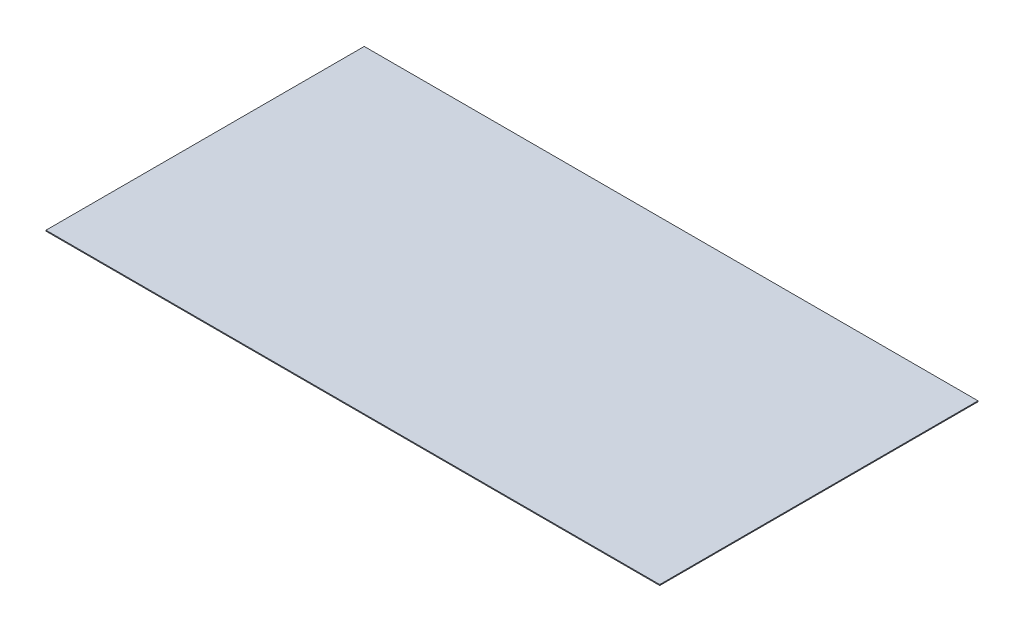
ISO-10303-21;
HEADER;
FILE_DESCRIPTION(('STEP AP214'),'2;1');
FILE_NAME('part.step','',(''),(''),'','','');
FILE_SCHEMA(('AUTOMOTIVE_DESIGN { 1 0 10303 214 1 1 1 1 }'));
ENDSEC;
DATA;
#1=APPLICATION_CONTEXT('core data for automotive mechanical design processes');
#2=APPLICATION_PROTOCOL_DEFINITION('international standard','automotive_design',2000,#1);
#3=PRODUCT_CONTEXT('',#1,'mechanical');
#4=PRODUCT('Part','Part','',(#3));
#5=PRODUCT_RELATED_PRODUCT_CATEGORY('part','',(#4));
#6=PRODUCT_DEFINITION_FORMATION('','',#4);
#7=PRODUCT_DEFINITION_CONTEXT('part definition',#1,'design');
#8=PRODUCT_DEFINITION('design','',#6,#7);
#9=PRODUCT_DEFINITION_SHAPE('','',#8);
#10=(LENGTH_UNIT() NAMED_UNIT(*) SI_UNIT(.MILLI.,.METRE.));
#11=(NAMED_UNIT(*) PLANE_ANGLE_UNIT() SI_UNIT($,.RADIAN.));
#12=(NAMED_UNIT(*) SI_UNIT($,.STERADIAN.) SOLID_ANGLE_UNIT());
#13=UNCERTAINTY_MEASURE_WITH_UNIT(LENGTH_MEASURE(1.E-05),#10,'distance_accuracy_value','');
#14=(GEOMETRIC_REPRESENTATION_CONTEXT(3) GLOBAL_UNCERTAINTY_ASSIGNED_CONTEXT((#13)) GLOBAL_UNIT_ASSIGNED_CONTEXT((#10,
#11,#12)) REPRESENTATION_CONTEXT('',''));
#15=CARTESIAN_POINT('',(0.,0.,0.));
#16=DIRECTION('',(0.,0.,1.));
#17=DIRECTION('',(1.,0.,0.));
#18=AXIS2_PLACEMENT_3D('',#15,#16,#17);
#19=CARTESIAN_POINT('',(0.,2.,0.));
#20=DIRECTION('',(1.,0.,0.));
#21=DIRECTION('',(0.,0.,-1.));
#22=AXIS2_PLACEMENT_3D('',#19,#20,#21);
#23=PLANE('',#22);
#24=DIRECTION('',(0.,0.,1.));
#25=VECTOR('',#24,1.);
#26=CARTESIAN_POINT('',(0.,0.,0.));
#27=LINE('',#26,#25);
#28=CARTESIAN_POINT('',(0.,0.,-700.));
#29=VERTEX_POINT('',#28);
#30=CARTESIAN_POINT('',(0.,0.,0.));
#31=VERTEX_POINT('',#30);
#32=EDGE_CURVE('E106',#29,#31,#27,.T.);
#33=ORIENTED_EDGE('',*,*,#32,.T.);
#34=DIRECTION('',(0.,-1.,0.));
#35=VECTOR('',#34,1.);
#36=CARTESIAN_POINT('',(0.,2.,0.));
#37=LINE('',#36,#35);
#38=CARTESIAN_POINT('',(0.,2.,0.));
#39=VERTEX_POINT('',#38);
#40=EDGE_CURVE('E11',#39,#31,#37,.T.);
#41=ORIENTED_EDGE('',*,*,#40,.F.);
#42=DIRECTION('',(0.,0.,1.));
#43=VECTOR('',#42,1.);
#44=CARTESIAN_POINT('',(0.,2.,0.));
#45=LINE('',#44,#43);
#46=CARTESIAN_POINT('',(0.,2.,-700.));
#47=VERTEX_POINT('',#46);
#48=EDGE_CURVE('E94',#47,#39,#45,.T.);
#49=ORIENTED_EDGE('',*,*,#48,.F.);
#50=DIRECTION('',(0.,-1.,0.));
#51=VECTOR('',#50,1.);
#52=CARTESIAN_POINT('',(0.,2.,-700.));
#53=LINE('',#52,#51);
#54=EDGE_CURVE('E105',#47,#29,#53,.T.);
#55=ORIENTED_EDGE('',*,*,#54,.T.);
#56=EDGE_LOOP('',(#33,#41,#49,#55));
#57=FACE_BOUND('',#56,.T.);
#58=ADVANCED_FACE('F43',(#57),#23,.F.);
#59=CARTESIAN_POINT('',(0.,2.,0.));
#60=DIRECTION('',(0.,0.,-1.));
#61=DIRECTION('',(-1.,0.,0.));
#62=AXIS2_PLACEMENT_3D('',#59,#60,#61);
#63=PLANE('',#62);
#64=DIRECTION('',(1.,0.,0.));
#65=VECTOR('',#64,1.);
#66=CARTESIAN_POINT('',(0.,0.,0.));
#67=LINE('',#66,#65);
#68=CARTESIAN_POINT('',(1350.,0.,0.));
#69=VERTEX_POINT('',#68);
#70=EDGE_CURVE('E98',#31,#69,#67,.T.);
#71=ORIENTED_EDGE('',*,*,#70,.T.);
#72=DIRECTION('',(0.,-1.,0.));
#73=VECTOR('',#72,1.);
#74=CARTESIAN_POINT('',(1350.,2.,0.));
#75=LINE('',#74,#73);
#76=CARTESIAN_POINT('',(1350.,2.,0.));
#77=VERTEX_POINT('',#76);
#78=EDGE_CURVE('E51',#77,#69,#75,.T.);
#79=ORIENTED_EDGE('',*,*,#78,.F.);
#80=DIRECTION('',(1.,0.,0.));
#81=VECTOR('',#80,1.);
#82=CARTESIAN_POINT('',(0.,2.,0.));
#83=LINE('',#82,#81);
#84=EDGE_CURVE('E90',#39,#77,#83,.T.);
#85=ORIENTED_EDGE('',*,*,#84,.F.);
#86=ORIENTED_EDGE('',*,*,#40,.T.);
#87=EDGE_LOOP('',(#71,#79,#85,#86));
#88=FACE_BOUND('',#87,.T.);
#89=ADVANCED_FACE('F100',(#88),#63,.F.);
#90=CARTESIAN_POINT('',(1350.,2.,0.));
#91=DIRECTION('',(-1.,0.,0.));
#92=DIRECTION('',(0.,0.,1.));
#93=AXIS2_PLACEMENT_3D('',#90,#91,#92);
#94=PLANE('',#93);
#95=DIRECTION('',(0.,0.,-1.));
#96=VECTOR('',#95,1.);
#97=CARTESIAN_POINT('',(1350.,0.,0.));
#98=LINE('',#97,#96);
#99=CARTESIAN_POINT('',(1350.,0.,-700.));
#100=VERTEX_POINT('',#99);
#101=EDGE_CURVE('E77',#69,#100,#98,.T.);
#102=ORIENTED_EDGE('',*,*,#101,.T.);
#103=DIRECTION('',(0.,-1.,0.));
#104=VECTOR('',#103,1.);
#105=CARTESIAN_POINT('',(1350.,2.,-700.));
#106=LINE('',#105,#104);
#107=CARTESIAN_POINT('',(1350.,2.,-700.));
#108=VERTEX_POINT('',#107);
#109=EDGE_CURVE('E97',#108,#100,#106,.T.);
#110=ORIENTED_EDGE('',*,*,#109,.F.);
#111=DIRECTION('',(0.,0.,-1.));
#112=VECTOR('',#111,1.);
#113=CARTESIAN_POINT('',(1350.,2.,0.));
#114=LINE('',#113,#112);
#115=EDGE_CURVE('E95',#77,#108,#114,.T.);
#116=ORIENTED_EDGE('',*,*,#115,.F.);
#117=ORIENTED_EDGE('',*,*,#78,.T.);
#118=EDGE_LOOP('',(#102,#110,#116,#117));
#119=FACE_BOUND('',#118,.T.);
#120=ADVANCED_FACE('F99',(#119),#94,.F.);
#121=CARTESIAN_POINT('',(0.,2.,-700.));
#122=DIRECTION('',(0.,0.,1.));
#123=DIRECTION('',(1.,0.,0.));
#124=AXIS2_PLACEMENT_3D('',#121,#122,#123);
#125=PLANE('',#124);
#126=DIRECTION('',(-1.,0.,0.));
#127=VECTOR('',#126,1.);
#128=CARTESIAN_POINT('',(0.,0.,-700.));
#129=LINE('',#128,#127);
#130=EDGE_CURVE('E85',#100,#29,#129,.T.);
#131=ORIENTED_EDGE('',*,*,#130,.T.);
#132=ORIENTED_EDGE('',*,*,#54,.F.);
#133=DIRECTION('',(-1.,0.,0.));
#134=VECTOR('',#133,1.);
#135=CARTESIAN_POINT('',(0.,2.,-700.));
#136=LINE('',#135,#134);
#137=EDGE_CURVE('E56',#108,#47,#136,.T.);
#138=ORIENTED_EDGE('',*,*,#137,.F.);
#139=ORIENTED_EDGE('',*,*,#109,.T.);
#140=EDGE_LOOP('',(#131,#132,#138,#139));
#141=FACE_BOUND('',#140,.T.);
#142=ADVANCED_FACE('F114',(#141),#125,.F.);
#143=CARTESIAN_POINT('',(0.,2.,0.));
#144=DIRECTION('',(0.,-1.,0.));
#145=DIRECTION('',(0.,0.,-1.));
#146=AXIS2_PLACEMENT_3D('',#143,#144,#145);
#147=PLANE('',#146);
#148=ORIENTED_EDGE('',*,*,#48,.T.);
#149=ORIENTED_EDGE('',*,*,#84,.T.);
#150=ORIENTED_EDGE('',*,*,#115,.T.);
#151=ORIENTED_EDGE('',*,*,#137,.T.);
#152=EDGE_LOOP('',(#148,#149,#150,#151));
#153=FACE_BOUND('',#152,.T.);
#154=ADVANCED_FACE('F89',(#153),#147,.F.);
#155=CARTESIAN_POINT('',(0.,0.,0.));
#156=DIRECTION('',(0.,-1.,0.));
#157=DIRECTION('',(0.,0.,-1.));
#158=AXIS2_PLACEMENT_3D('',#155,#156,#157);
#159=PLANE('',#158);
#160=ORIENTED_EDGE('',*,*,#32,.F.);
#161=ORIENTED_EDGE('',*,*,#130,.F.);
#162=ORIENTED_EDGE('',*,*,#101,.F.);
#163=ORIENTED_EDGE('',*,*,#70,.F.);
#164=EDGE_LOOP('',(#160,#161,#162,#163));
#165=FACE_BOUND('',#164,.T.);
#166=ADVANCED_FACE('F117',(#165),#159,.T.);
#167=CLOSED_SHELL('',(#58,#89,#120,#142,#154,#166));
#168=MANIFOLD_SOLID_BREP('B2',#167);
#169=ADVANCED_BREP_SHAPE_REPRESENTATION('',(#18,#168),#14);
#170=SHAPE_DEFINITION_REPRESENTATION(#9,#169);
ENDSEC;
END-ISO-10303-21;
